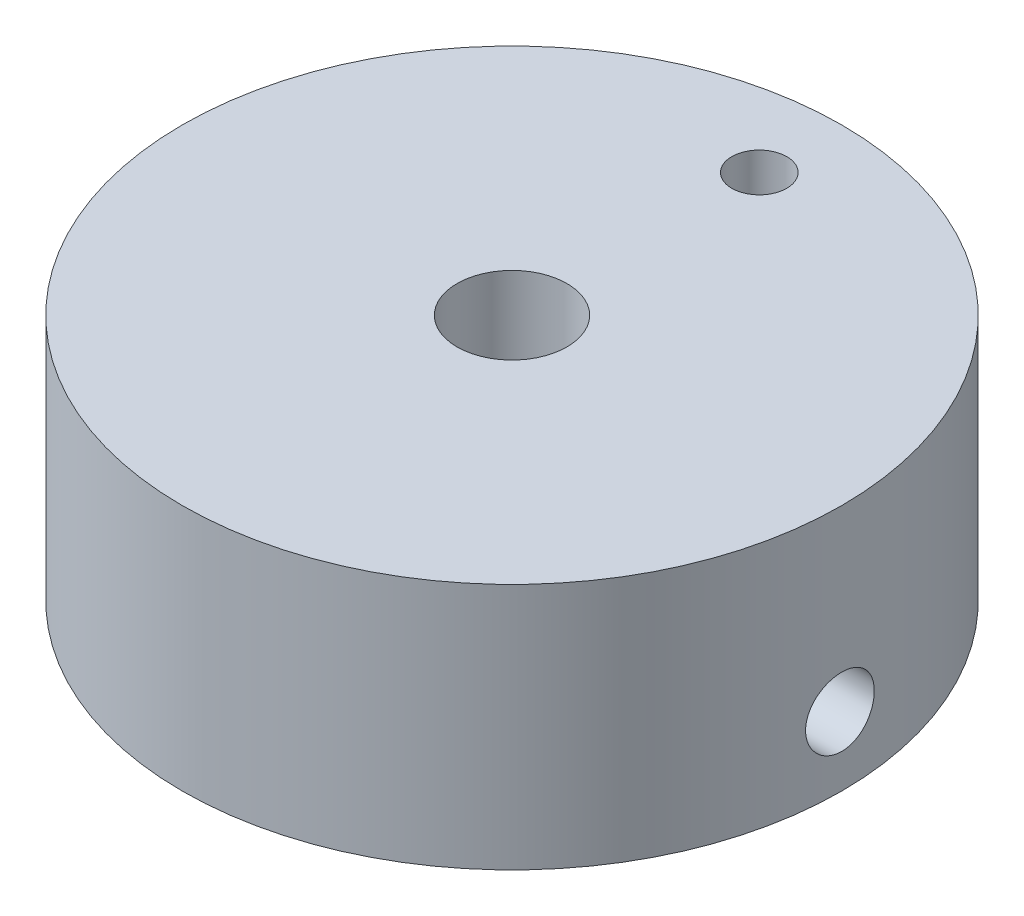
ISO-10303-21;
HEADER;
FILE_DESCRIPTION(('STEP AP214'),'2;1');
FILE_NAME('part.step','',(''),(''),'','','');
FILE_SCHEMA(('AUTOMOTIVE_DESIGN { 1 0 10303 214 1 1 1 1 }'));
ENDSEC;
DATA;
#1=APPLICATION_CONTEXT('core data for automotive mechanical design processes');
#2=APPLICATION_PROTOCOL_DEFINITION('international standard','automotive_design',2000,#1);
#3=PRODUCT_CONTEXT('',#1,'mechanical');
#4=PRODUCT('Part','Part','',(#3));
#5=PRODUCT_RELATED_PRODUCT_CATEGORY('part','',(#4));
#6=PRODUCT_DEFINITION_FORMATION('','',#4);
#7=PRODUCT_DEFINITION_CONTEXT('part definition',#1,'design');
#8=PRODUCT_DEFINITION('design','',#6,#7);
#9=PRODUCT_DEFINITION_SHAPE('','',#8);
#10=(LENGTH_UNIT() NAMED_UNIT(*) SI_UNIT(.MILLI.,.METRE.));
#11=(NAMED_UNIT(*) PLANE_ANGLE_UNIT() SI_UNIT($,.RADIAN.));
#12=(NAMED_UNIT(*) SI_UNIT($,.STERADIAN.) SOLID_ANGLE_UNIT());
#13=UNCERTAINTY_MEASURE_WITH_UNIT(LENGTH_MEASURE(1.E-05),#10,'distance_accuracy_value','');
#14=(GEOMETRIC_REPRESENTATION_CONTEXT(3) GLOBAL_UNCERTAINTY_ASSIGNED_CONTEXT((#13)) GLOBAL_UNIT_ASSIGNED_CONTEXT((#10,
#11,#12)) REPRESENTATION_CONTEXT('',''));
#15=CARTESIAN_POINT('',(0.,0.,0.));
#16=DIRECTION('',(0.,0.,1.));
#17=DIRECTION('',(1.,0.,0.));
#18=AXIS2_PLACEMENT_3D('',#15,#16,#17);
#19=CARTESIAN_POINT('',(0.,0.,0.));
#20=DIRECTION('',(0.,1.,0.));
#21=DIRECTION('',(0.,0.,1.));
#22=AXIS2_PLACEMENT_3D('',#19,#20,#21);
#23=PLANE('',#22);
#24=CARTESIAN_POINT('',(0.,0.,0.));
#25=DIRECTION('',(0.,1.,0.));
#26=DIRECTION('',(0.,0.,1.));
#27=AXIS2_PLACEMENT_3D('',#24,#25,#26);
#28=CIRCLE('',#27,2.);
#29=CARTESIAN_POINT('',(0.,0.,2.));
#30=VERTEX_POINT('',#29);
#31=EDGE_CURVE('E58',#30,#30,#28,.T.);
#32=ORIENTED_EDGE('',*,*,#31,.T.);
#33=EDGE_LOOP('',(#32));
#34=FACE_BOUND('',#33,.T.);
#35=CARTESIAN_POINT('',(0.,0.,0.));
#36=DIRECTION('',(0.,-1.,0.));
#37=DIRECTION('',(0.,0.,-1.));
#38=AXIS2_PLACEMENT_3D('',#35,#36,#37);
#39=CIRCLE('',#38,3.5);
#40=CARTESIAN_POINT('',(0.,0.,-3.5));
#41=VERTEX_POINT('',#40);
#42=EDGE_CURVE('E120',#41,#41,#39,.T.);
#43=ORIENTED_EDGE('',*,*,#42,.T.);
#44=EDGE_LOOP('',(#43));
#45=FACE_BOUND('',#44,.T.);
#46=ADVANCED_FACE('F39',(#34,#45),#23,.F.);
#47=CARTESIAN_POINT('',(0.,9.,0.));
#48=DIRECTION('',(0.,-1.,0.));
#49=DIRECTION('',(0.,0.,-1.));
#50=AXIS2_PLACEMENT_3D('',#47,#48,#49);
#51=CYLINDRICAL_SURFACE('',#50,12.);
#52=CARTESIAN_POINT('',(0.,9.,0.));
#53=DIRECTION('',(0.,1.,0.));
#54=DIRECTION('',(0.,0.,1.));
#55=AXIS2_PLACEMENT_3D('',#52,#53,#54);
#56=CIRCLE('',#55,12.);
#57=CARTESIAN_POINT('',(0.,9.,12.));
#58=VERTEX_POINT('',#57);
#59=EDGE_CURVE('E10',#58,#58,#56,.T.);
#60=ORIENTED_EDGE('',*,*,#59,.F.);
#61=EDGE_LOOP('',(#60));
#62=FACE_BOUND('',#61,.T.);
#63=CARTESIAN_POINT('',(0.,0.,0.));
#64=DIRECTION('',(0.,1.,0.));
#65=DIRECTION('',(0.,0.,1.));
#66=AXIS2_PLACEMENT_3D('',#63,#64,#65);
#67=CIRCLE('',#66,12.);
#68=CARTESIAN_POINT('',(0.,0.,12.));
#69=VERTEX_POINT('',#68);
#70=EDGE_CURVE('E53',#69,#69,#67,.T.);
#71=ORIENTED_EDGE('',*,*,#70,.T.);
#72=EDGE_LOOP('',(#71));
#73=FACE_BOUND('',#72,.T.);
#74=CARTESIAN_POINT('',(11.93471826228,2.5,1.25));
#75=CARTESIAN_POINT('',(11.9347191150424,2.42999161232566,1.24999697518322));
#76=CARTESIAN_POINT('',(11.9353409008733,2.35993731760407,1.24409877692397));
#77=CARTESIAN_POINT('',(11.9377604270999,2.22177211791096,1.22065943041038));
#78=CARTESIAN_POINT('',(11.9395594532585,2.15366342287391,1.20310555170272));
#79=CARTESIAN_POINT('',(11.9441275217712,2.02141020375438,1.15687251656011));
#80=CARTESIAN_POINT('',(11.9468959653314,1.95726326126662,1.1282002266226));
#81=CARTESIAN_POINT('',(11.9530902004971,1.83470581039826,1.06055770334252));
#82=CARTESIAN_POINT('',(11.9565158642756,1.7762941898514,1.02158947197067));
#83=CARTESIAN_POINT('',(11.9636536449667,1.6666221821392,0.934296678407943));
#84=CARTESIAN_POINT('',(11.967366722546,1.61538754113538,0.885939844855282));
#85=CARTESIAN_POINT('',(11.9746522541305,1.52174566920759,0.781311583098957));
#86=CARTESIAN_POINT('',(11.9782247016127,1.47933884736844,0.725039788315086));
#87=CARTESIAN_POINT('',(11.9848360068635,1.4044667974439,0.606020494104223));
#88=CARTESIAN_POINT('',(11.987873629993,1.37202444712256,0.543258528434127));
#89=CARTESIAN_POINT('',(11.99306255589,1.31814864374241,0.413140786628793));
#90=CARTESIAN_POINT('',(11.9952138819629,1.29671490120643,0.345785131339821));
#91=CARTESIAN_POINT('',(11.9983810704125,1.26554050090853,0.208652729588977));
#92=CARTESIAN_POINT('',(11.999401047473,1.25575746024736,0.138885714600318));
#93=CARTESIAN_POINT('',(12.0002046174434,1.24803099594927,-0.00130690592329531));
#94=CARTESIAN_POINT('',(11.9999882449266,1.25008724123906,-0.0717324929869851));
#95=CARTESIAN_POINT('',(11.9983468568877,1.2659466414109,-0.210955320524874));
#96=CARTESIAN_POINT('',(11.9969265307067,1.27970422086826,-0.279757815683589));
#97=CARTESIAN_POINT('',(11.9930422118587,1.31850472481392,-0.414071941104615));
#98=CARTESIAN_POINT('',(11.990578204652,1.34354780652158,-0.479583525506811));
#99=CARTESIAN_POINT('',(11.9848754491254,1.40425817632148,-0.605599466983969));
#100=CARTESIAN_POINT('',(11.981635237351,1.43994556469558,-0.666094071486266));
#101=CARTESIAN_POINT('',(11.974743492089,1.52091691518019,-0.780252420210233));
#102=CARTESIAN_POINT('',(11.9710919455069,1.56620118283928,-0.833915946854722));
#103=CARTESIAN_POINT('',(11.963766675583,1.66533699661674,-0.933155896006396));
#104=CARTESIAN_POINT('',(11.9600929292666,1.71922820058642,-0.978692709827727));
#105=CARTESIAN_POINT('',(11.9531545861231,1.83391080822329,-1.06007978169065));
#106=CARTESIAN_POINT('',(11.9498899899754,1.89470222334929,-1.09593002364596));
#107=CARTESIAN_POINT('',(11.944139339682,2.02149078075045,-1.15692647329621));
#108=CARTESIAN_POINT('',(11.9416534715147,2.08748916186732,-1.18207012452017));
#109=CARTESIAN_POINT('',(11.9377455447301,2.22280266139245,-1.22090774282747));
#110=CARTESIAN_POINT('',(11.9363234508818,2.29211766987692,-1.2346020891004));
#111=CARTESIAN_POINT('',(11.9347102430423,2.43174878649403,-1.25010118777219));
#112=CARTESIAN_POINT('',(11.9345133869079,2.50205867463572,-1.25196140238156));
#113=CARTESIAN_POINT('',(11.9353577854573,2.641989150664,-1.24388519226921));
#114=CARTESIAN_POINT('',(11.9363990219608,2.71160974865697,-1.23394894076646));
#115=CARTESIAN_POINT('',(11.9395970583523,2.84802302111028,-1.20260829999998));
#116=CARTESIAN_POINT('',(11.9417512975577,2.91482180772134,-1.18123023085877));
#117=CARTESIAN_POINT('',(11.9469305336369,3.04388546043428,-1.12763970354659));
#118=CARTESIAN_POINT('',(11.9499555520955,3.10615021409802,-1.09542697680141));
#119=CARTESIAN_POINT('',(11.9565493817568,3.22463084933737,-1.02094298796706));
#120=CARTESIAN_POINT('',(11.9601201592886,3.28082355125212,-0.978635031111928));
#121=CARTESIAN_POINT('',(11.967396775493,3.38532970135615,-0.88521403435345));
#122=CARTESIAN_POINT('',(11.9711026177939,3.43364293768763,-0.834100757774513));
#123=CARTESIAN_POINT('',(11.9782491893122,3.52121052312097,-0.72427917668722));
#124=CARTESIAN_POINT('',(11.9816888233373,3.56042865095765,-0.665541909470564));
#125=CARTESIAN_POINT('',(11.9878994174722,3.62844330330774,-0.542282402189452));
#126=CARTESIAN_POINT('',(11.9906703874177,3.65723998111873,-0.477760247237037));
#127=CARTESIAN_POINT('',(11.9952265074374,3.70353316317402,-0.34488802523341));
#128=CARTESIAN_POINT('',(11.9970135525649,3.72105140095761,-0.276545597858168));
#129=CARTESIAN_POINT('',(11.9994082618957,3.74436132253283,-0.137869776943723));
#130=CARTESIAN_POINT('',(12.0000159622655,3.75015336592635,-0.0675364445257738));
#131=CARTESIAN_POINT('',(11.9999834694783,3.7498411794133,0.0727692297748155));
#132=CARTESIAN_POINT('',(11.9993491685798,3.74379312092574,0.142741704768554));
#133=CARTESIAN_POINT('',(11.996915580434,3.72009037967924,0.280670736530767));
#134=CARTESIAN_POINT('',(11.9951162924927,3.70243569000579,0.348627292098257));
#135=CARTESIAN_POINT('',(11.990554266156,3.65603672857729,0.480593939441468));
#136=CARTESIAN_POINT('',(11.9877916847795,3.62729426407236,0.544604672394931));
#137=CARTESIAN_POINT('',(11.9816107070057,3.55954158187077,0.666902233444958));
#138=CARTESIAN_POINT('',(11.9781923126532,3.52053139618754,0.725189079387079));
#139=CARTESIAN_POINT('',(11.9710630656975,3.43314031847674,0.834672111183025));
#140=CARTESIAN_POINT('',(11.9673509527786,3.38471758354817,0.885834816188336));
#141=CARTESIAN_POINT('',(11.960063235384,3.27995948076493,0.979332809391577));
#142=CARTESIAN_POINT('',(11.9564876638058,3.22362222113315,1.02166598107297));
#143=CARTESIAN_POINT('',(11.9498674099473,3.10446396710885,1.09639613404272));
#144=CARTESIAN_POINT('',(11.94682420674,3.04162565724996,1.12876561682157));
#145=CARTESIAN_POINT('',(11.9416308093055,2.91141319106628,1.18244985814836));
#146=CARTESIAN_POINT('',(11.9394796137875,2.84404421977557,1.203777018579));
#147=CARTESIAN_POINT('',(11.9368532731593,2.73024876142971,1.22948475987797));
#148=CARTESIAN_POINT('',(11.9360564602914,2.68454844517094,1.23716737923509));
#149=CARTESIAN_POINT('',(11.9349886741132,2.59257210934299,1.24742598754874));
#150=CARTESIAN_POINT('',(11.9347176983538,2.54629609245642,1.2500020002917));
#151=CARTESIAN_POINT('',(11.93471826228,2.5,1.25));
#152=B_SPLINE_CURVE_WITH_KNOTS('',3,(#74,#75,#76,#77,#78,#79,#80,#81,#82,#83,#84,#85,#86,#87,
#88,#89,#90,#91,#92,#93,#94,#95,#96,#97,#98,#99,#100,#101,#102,#103,#104,#105,#106,#107,#108,
#109,#110,#111,#112,#113,#114,#115,#116,#117,#118,#119,#120,#121,#122,#123,#124,#125,#126,#127,
#128,#129,#130,#131,#132,#133,#134,#135,#136,#137,#138,#139,#140,#141,#142,#143,#144,#145,#146,
#147,#148,#149,#150,#151),.UNSPECIFIED.,.T.,.F.,(4,2,2,2,2,2,2,2,2,2,2,2,2,2,2,2,2,2,2,2,2,2,2,
2,2,2,2,2,2,2,2,2,2,2,2,2,2,2,4),(0.,0.209856088918114,0.419941762656934,0.629897897997549,
0.839813238904374,1.05046331966474,1.26112315986553,1.47226310667903,1.68339750117152,
1.89376146209515,2.1041195404386,2.31366202924334,2.52320743729405,2.73315107506366,
2.94310139809176,3.15404859825978,3.36499614874125,3.57599404011223,3.78698494316603,
3.99698627668495,4.20698452658867,4.41650177142426,4.62602421024736,4.83632015771437,
5.04662175854641,5.25774702917369,5.46886919406139,5.67958329938647,5.89029094273986,
6.10000137609484,6.30971193438228,6.51938832536296,6.72906406260766,6.93969414529675,
7.15037465998275,7.36163151780615,7.57265059074992,7.71142770693246,7.85020417669335),.UNSPECIFIED.);
#153=CARTESIAN_POINT('',(11.93471826228,2.5,1.25));
#154=VERTEX_POINT('',#153);
#155=EDGE_CURVE('E69',#154,#154,#152,.T.);
#156=ORIENTED_EDGE('',*,*,#155,.F.);
#157=EDGE_LOOP('',(#156));
#158=FACE_BOUND('',#157,.T.);
#159=ADVANCED_FACE('F41',(#62,#73,#158),#51,.T.);
#160=CARTESIAN_POINT('',(0.,0.,0.));
#161=DIRECTION('',(0.,1.,0.));
#162=DIRECTION('',(0.,0.,1.));
#163=AXIS2_PLACEMENT_3D('',#160,#161,#162);
#164=CYLINDRICAL_SURFACE('',#163,2.);
#165=ORIENTED_EDGE('',*,*,#31,.F.);
#166=EDGE_LOOP('',(#165));
#167=FACE_BOUND('',#166,.T.);
#168=CARTESIAN_POINT('',(0.,9.,0.));
#169=DIRECTION('',(0.,1.,0.));
#170=DIRECTION('',(0.,0.,1.));
#171=AXIS2_PLACEMENT_3D('',#168,#169,#170);
#172=CIRCLE('',#171,2.);
#173=CARTESIAN_POINT('',(0.,9.,2.));
#174=VERTEX_POINT('',#173);
#175=EDGE_CURVE('E60',#174,#174,#172,.T.);
#176=ORIENTED_EDGE('',*,*,#175,.T.);
#177=EDGE_LOOP('',(#176));
#178=FACE_BOUND('',#177,.T.);
#179=CARTESIAN_POINT('',(1.5612494995996,2.5,1.25));
#180=CARTESIAN_POINT('',(1.56125800072558,2.56212028180293,1.24999462210485));
#181=CARTESIAN_POINT('',(1.56502642708837,2.62433783537026,1.24532693849666));
#182=CARTESIAN_POINT('',(1.57943717205478,2.74667632007938,1.22698950832934));
#183=CARTESIAN_POINT('',(1.59009816464115,2.80679108636524,1.21329530430551));
#184=CARTESIAN_POINT('',(1.61650085329041,2.92278232269884,1.17788073911871));
#185=CARTESIAN_POINT('',(1.63219837418033,2.97869060868181,1.15622993332784));
#186=CARTESIAN_POINT('',(1.66682950714432,3.08600886163816,1.10571945561924));
#187=CARTESIAN_POINT('',(1.68576320748676,3.13741870585651,1.07685958706091));
#188=CARTESIAN_POINT('',(1.72779611374711,3.24186515447698,1.00823937928364));
#189=CARTESIAN_POINT('',(1.75111338227346,3.29419474083259,0.967536093692502));
#190=CARTESIAN_POINT('',(1.79752820854877,3.39188269914497,0.878308664496878));
#191=CARTESIAN_POINT('',(1.82062555863329,3.43723499728392,0.829777781297412));
#192=CARTESIAN_POINT('',(1.86729453891009,3.52510358514812,0.71918666525849));
#193=CARTESIAN_POINT('',(1.8905872224145,3.56661766810431,0.656200568910555));
#194=CARTESIAN_POINT('',(1.9318323169914,3.63812520476316,0.522404070837314));
#195=CARTESIAN_POINT('',(1.94979001179838,3.66813006575126,0.45160150647824));
#196=CARTESIAN_POINT('',(1.97669841318201,3.71248231060706,0.311776878362017));
#197=CARTESIAN_POINT('',(1.98637922422038,3.72811141639694,0.24330563604724));
#198=CARTESIAN_POINT('',(1.99850544379202,3.7476320696434,0.104105100662262));
#199=CARTESIAN_POINT('',(2.00095845843657,3.75153595612055,0.0333782605640262));
#200=CARTESIAN_POINT('',(1.99852909107528,3.74764431072239,-0.0980658284213407));
#201=CARTESIAN_POINT('',(1.99458699811902,3.7413486236991,-0.158852523273786));
#202=CARTESIAN_POINT('',(1.98145272261225,3.72013301563668,-0.27830664590367));
#203=CARTESIAN_POINT('',(1.97226014325117,3.70521244276248,-0.336973913146974));
#204=CARTESIAN_POINT('',(1.94938133614675,3.66739622490288,-0.450889117077073));
#205=CARTESIAN_POINT('',(1.93568361673912,3.64448017595141,-0.506127875493233));
#206=CARTESIAN_POINT('',(1.90485632889331,3.59153124474001,-0.612019220469382));
#207=CARTESIAN_POINT('',(1.88772597874226,3.5614967411094,-0.662670758560001));
#208=CARTESIAN_POINT('',(1.84893224750793,3.49097183467063,-0.764713515567041));
#209=CARTESIAN_POINT('',(1.82697004307144,3.44964537325767,-0.815412344918949));
#210=CARTESIAN_POINT('',(1.78195462752237,3.35986761977663,-0.909598595905498));
#211=CARTESIAN_POINT('',(1.75889986449171,3.31140597355345,-0.953075338789632));
#212=CARTESIAN_POINT('',(1.71071442112196,3.2012943770939,-1.03735445892932));
#213=CARTESIAN_POINT('',(1.68570581533195,3.1387486191497,-1.07706615479946));
#214=CARTESIAN_POINT('',(1.640141390954,3.00635388022658,-1.14526153203309));
#215=CARTESIAN_POINT('',(1.6195774019168,2.93651865604459,-1.17376589603358));
#216=CARTESIAN_POINT('',(1.5909187656712,2.81023059711213,-1.21218566853166));
#217=CARTESIAN_POINT('',(1.58096704305272,2.75508903736233,-1.22501841721721));
#218=CARTESIAN_POINT('',(1.56679138875765,2.64288481125107,-1.24310168537523));
#219=CARTESIAN_POINT('',(1.56255963237428,2.5858248789601,-1.24836256353275));
#220=CARTESIAN_POINT('',(1.56046133530164,2.47127131945973,-1.25098535954508));
#221=CARTESIAN_POINT('',(1.56260938140435,2.41377699863418,-1.24832917576576));
#222=CARTESIAN_POINT('',(1.57296042862705,2.3002194189684,-1.23525733555987));
#223=CARTESIAN_POINT('',(1.58116844404657,2.24415738503708,-1.22483525320262));
#224=CARTESIAN_POINT('',(1.60230060601957,2.13578161613419,-1.1970493572483));
#225=CARTESIAN_POINT('',(1.61514477937171,2.08342132666849,-1.17980280626788));
#226=CARTESIAN_POINT('',(1.64415573440842,1.98221266544302,-1.13902451938523));
#227=CARTESIAN_POINT('',(1.66032369489908,1.9333655479755,-1.11549055271421));
#228=CARTESIAN_POINT('',(1.69787203988937,1.83069396082297,-1.05765376772319));
#229=CARTESIAN_POINT('',(1.7196587573829,1.77769245875067,-1.02215373814221));
#230=CARTESIAN_POINT('',(1.76393958000711,1.67781494756085,-0.943690263224862));
#231=CARTESIAN_POINT('',(1.78643439903354,1.63094538302204,-0.900719074496599));
#232=CARTESIAN_POINT('',(1.83383164018972,1.53701675375684,-0.800380659499192));
#233=CARTESIAN_POINT('',(1.85854204787597,1.49113144299232,-0.741809949714162));
#234=CARTESIAN_POINT('',(1.90384248964999,1.40993134812414,-0.616299987869576));
#235=CARTESIAN_POINT('',(1.92443445329133,1.37461161002636,-0.54936467874866));
#236=CARTESIAN_POINT('',(1.95809255957561,1.31800500879736,-0.412925900636597));
#237=CARTESIAN_POINT('',(1.9715348458918,1.29600579352924,-0.343814822544517));
#238=CARTESIAN_POINT('',(1.9910701008804,1.26427333131891,-0.201860998884744));
#239=CARTESIAN_POINT('',(1.99717323933003,1.25452311023889,-0.129023563238365));
#240=CARTESIAN_POINT('',(2.00096685748559,1.24845347996122,0.00659907199681402));
#241=CARTESIAN_POINT('',(1.99976600623617,1.25036422321302,0.0692812975954758));
#242=CARTESIAN_POINT('',(1.99160739958772,1.26346167497434,0.193279811091727));
#243=CARTESIAN_POINT('',(1.98464990541518,1.27464796257577,0.254596160840744));
#244=CARTESIAN_POINT('',(1.9659610468898,1.30516047487659,0.372043294685527));
#245=CARTESIAN_POINT('',(1.95440367471701,1.3241908398732,0.42828018067831));
#246=CARTESIAN_POINT('',(1.92744968677265,1.36955992816407,0.536714369111315));
#247=CARTESIAN_POINT('',(1.91205242331406,1.39589988447559,0.58891098811824));
#248=CARTESIAN_POINT('',(1.87675342239825,1.4581605789912,0.693656737470667));
#249=CARTESIAN_POINT('',(1.85655002466956,1.49479198131898,0.745680127162212));
#250=CARTESIAN_POINT('',(1.81433640456238,1.5750766303327,0.843216608355415));
#251=CARTESIAN_POINT('',(1.7923241573062,1.61873780024594,0.888722243055231));
#252=CARTESIAN_POINT('',(1.74500415099525,1.71911626230327,0.978723601300806));
#253=CARTESIAN_POINT('',(1.71967871446314,1.77680834517692,1.02212829873816));
#254=CARTESIAN_POINT('',(1.67174821497037,1.89964466601012,1.09877325005744));
#255=CARTESIAN_POINT('',(1.64914165167051,1.9647847549076,1.132019125571));
#256=CARTESIAN_POINT('',(1.61429776080214,2.08640276792967,1.18099110923231));
#257=CARTESIAN_POINT('',(1.60087340349652,2.14163568087936,1.19896216276381));
#258=CARTESIAN_POINT('',(1.57939158437939,2.25496927795719,1.22712822180408));
#259=CARTESIAN_POINT('',(1.57131714400176,2.31306025502414,1.23734784245405));
#260=CARTESIAN_POINT('',(1.56476456389394,2.39303052386285,1.24559906183097));
#261=CARTESIAN_POINT('',(1.56345069546827,2.41436414551699,1.24724671259581));
#262=CARTESIAN_POINT('',(1.56169158695047,2.45712796652149,1.24944824734288));
#263=CARTESIAN_POINT('',(1.56124656529967,2.47855818880168,1.25000185626673));
#264=CARTESIAN_POINT('',(1.5612494995996,2.5,1.25));
#265=B_SPLINE_CURVE_WITH_KNOTS('',3,(#179,#180,#181,#182,#183,#184,#185,#186,#187,#188,#189,
#190,#191,#192,#193,#194,#195,#196,#197,#198,#199,#200,#201,#202,#203,#204,#205,#206,#207,#208,
#209,#210,#211,#212,#213,#214,#215,#216,#217,#218,#219,#220,#221,#222,#223,#224,#225,#226,#227,
#228,#229,#230,#231,#232,#233,#234,#235,#236,#237,#238,#239,#240,#241,#242,#243,#244,#245,#246,
#247,#248,#249,#250,#251,#252,#253,#254,#255,#256,#257,#258,#259,#260,#261,#262,#263,#264),
.UNSPECIFIED.,.T.,.F.,(4,2,2,2,2,2,2,2,2,2,2,2,2,2,2,2,2,2,2,2,2,2,2,2,2,2,2,2,2,2,2,2,2,2,2,2,
2,2,2,2,2,2,4),(0.,0.186262444012015,0.373031654397096,0.558205556130402,0.743384509377751,
0.953406207440075,1.16360970997911,1.39917236034457,1.6345009273926,1.84590412815398,
2.05708478092387,2.23992319583511,2.42277543076414,2.60609774825956,2.78946186128171,
2.99564504832107,3.20213044016186,3.43558067920821,3.66859805095277,3.84032775480268,
4.01182230007289,4.18370925240739,4.35573859160081,4.52493212343598,4.69418576487135,
4.89566333610129,5.09735098485254,5.33136598660889,5.56527109061626,5.78520080494549,
6.00482541258961,6.19203601525124,6.37923812308583,6.55994569114424,6.74068376037881,
6.94018144108745,7.13990556958868,7.36841817421249,7.59680409585386,7.77496902270413,
7.95256577963385,8.01684109069498,8.08113255947022),.UNSPECIFIED.);
#266=CARTESIAN_POINT('',(1.5612494995996,2.5,1.25));
#267=VERTEX_POINT('',#266);
#268=EDGE_CURVE('E44',#267,#267,#265,.T.);
#269=ORIENTED_EDGE('',*,*,#268,.F.);
#270=EDGE_LOOP('',(#269));
#271=FACE_BOUND('',#270,.T.);
#272=ADVANCED_FACE('F96',(#167,#178,#271),#164,.F.);
#273=CARTESIAN_POINT('',(0.,9.,0.));
#274=DIRECTION('',(0.,1.,0.));
#275=DIRECTION('',(0.,0.,1.));
#276=AXIS2_PLACEMENT_3D('',#273,#274,#275);
#277=PLANE('',#276);
#278=CARTESIAN_POINT('',(0.,9.,-9.));
#279=DIRECTION('',(0.,1.,0.));
#280=DIRECTION('',(0.,0.,1.));
#281=AXIS2_PLACEMENT_3D('',#278,#279,#280);
#282=CIRCLE('',#281,1.);
#283=CARTESIAN_POINT('',(0.,9.,-8.));
#284=VERTEX_POINT('',#283);
#285=EDGE_CURVE('E66',#284,#284,#282,.T.);
#286=ORIENTED_EDGE('',*,*,#285,.F.);
#287=EDGE_LOOP('',(#286));
#288=FACE_BOUND('',#287,.T.);
#289=ORIENTED_EDGE('',*,*,#175,.F.);
#290=EDGE_LOOP('',(#289));
#291=FACE_BOUND('',#290,.T.);
#292=ORIENTED_EDGE('',*,*,#59,.T.);
#293=EDGE_LOOP('',(#292));
#294=FACE_BOUND('',#293,.T.);
#295=ADVANCED_FACE('F100',(#288,#291,#294),#277,.T.);
#296=CARTESIAN_POINT('',(0.,0.,0.));
#297=DIRECTION('',(0.,-1.,0.));
#298=DIRECTION('',(0.,0.,-1.));
#299=AXIS2_PLACEMENT_3D('',#296,#297,#298);
#300=CIRCLE('',#299,7.5);
#301=CARTESIAN_POINT('',(0.,0.,-7.5));
#302=VERTEX_POINT('',#301);
#303=EDGE_CURVE('E77',#302,#302,#300,.T.);
#304=ORIENTED_EDGE('',*,*,#303,.F.);
#305=EDGE_LOOP('',(#304));
#306=FACE_BOUND('',#305,.T.);
#307=ORIENTED_EDGE('',*,*,#70,.F.);
#308=EDGE_LOOP('',(#307));
#309=FACE_BOUND('',#308,.T.);
#310=ADVANCED_FACE('F94',(#306,#309),#23,.F.);
#311=CARTESIAN_POINT('',(0.,6.,-9.));
#312=DIRECTION('',(0.,1.,0.));
#313=DIRECTION('',(0.,0.,1.));
#314=AXIS2_PLACEMENT_3D('',#311,#312,#313);
#315=CYLINDRICAL_SURFACE('',#314,1.);
#316=CARTESIAN_POINT('',(0.,6.,-9.));
#317=DIRECTION('',(0.,1.,0.));
#318=DIRECTION('',(0.,0.,1.));
#319=AXIS2_PLACEMENT_3D('',#316,#317,#318);
#320=CIRCLE('',#319,1.);
#321=CARTESIAN_POINT('',(0.,6.,-8.));
#322=VERTEX_POINT('',#321);
#323=EDGE_CURVE('E63',#322,#322,#320,.T.);
#324=ORIENTED_EDGE('',*,*,#323,.F.);
#325=EDGE_LOOP('',(#324));
#326=FACE_BOUND('',#325,.T.);
#327=ORIENTED_EDGE('',*,*,#285,.T.);
#328=EDGE_LOOP('',(#327));
#329=FACE_BOUND('',#328,.T.);
#330=ADVANCED_FACE('F91',(#326,#329),#315,.F.);
#331=CARTESIAN_POINT('',(0.,6.,-9.));
#332=DIRECTION('',(0.,1.,0.));
#333=DIRECTION('',(0.,0.,1.));
#334=AXIS2_PLACEMENT_3D('',#331,#332,#333);
#335=PLANE('',#334);
#336=ORIENTED_EDGE('',*,*,#323,.T.);
#337=EDGE_LOOP('',(#336));
#338=FACE_BOUND('',#337,.T.);
#339=ADVANCED_FACE('F85',(#338),#335,.T.);
#340=CARTESIAN_POINT('',(13.,2.5,0.));
#341=DIRECTION('',(-1.,0.,0.));
#342=DIRECTION('',(0.,0.,1.));
#343=AXIS2_PLACEMENT_3D('',#340,#341,#342);
#344=CYLINDRICAL_SURFACE('',#343,1.25);
#345=ORIENTED_EDGE('',*,*,#268,.T.);
#346=EDGE_LOOP('',(#345));
#347=FACE_BOUND('',#346,.T.);
#348=ORIENTED_EDGE('',*,*,#155,.T.);
#349=EDGE_LOOP('',(#348));
#350=FACE_BOUND('',#349,.T.);
#351=ADVANCED_FACE('F79',(#347,#350),#344,.F.);
#352=CARTESIAN_POINT('',(0.,0.3,0.));
#353=DIRECTION('',(0.,-1.,0.));
#354=DIRECTION('',(0.,0.,-1.));
#355=AXIS2_PLACEMENT_3D('',#352,#353,#354);
#356=CYLINDRICAL_SURFACE('',#355,7.5);
#357=CARTESIAN_POINT('',(0.,0.3,0.));
#358=DIRECTION('',(0.,-1.,0.));
#359=DIRECTION('',(0.,0.,-1.));
#360=AXIS2_PLACEMENT_3D('',#357,#358,#359);
#361=CIRCLE('',#360,7.5);
#362=CARTESIAN_POINT('',(0.,0.3,-7.5));
#363=VERTEX_POINT('',#362);
#364=EDGE_CURVE('E126',#363,#363,#361,.T.);
#365=ORIENTED_EDGE('',*,*,#364,.F.);
#366=EDGE_LOOP('',(#365));
#367=FACE_BOUND('',#366,.T.);
#368=ORIENTED_EDGE('',*,*,#303,.T.);
#369=EDGE_LOOP('',(#368));
#370=FACE_BOUND('',#369,.T.);
#371=ADVANCED_FACE('F84',(#367,#370),#356,.F.);
#372=CARTESIAN_POINT('',(0.,0.3,0.));
#373=DIRECTION('',(0.,-1.,0.));
#374=DIRECTION('',(0.,0.,-1.));
#375=AXIS2_PLACEMENT_3D('',#372,#373,#374);
#376=PLANE('',#375);
#377=CARTESIAN_POINT('',(0.,0.3,0.));
#378=DIRECTION('',(0.,-1.,0.));
#379=DIRECTION('',(0.,0.,-1.));
#380=AXIS2_PLACEMENT_3D('',#377,#378,#379);
#381=CIRCLE('',#380,3.5);
#382=CARTESIAN_POINT('',(0.,0.3,-3.5));
#383=VERTEX_POINT('',#382);
#384=EDGE_CURVE('E122',#383,#383,#381,.T.);
#385=ORIENTED_EDGE('',*,*,#384,.F.);
#386=EDGE_LOOP('',(#385));
#387=FACE_BOUND('',#386,.T.);
#388=ORIENTED_EDGE('',*,*,#364,.T.);
#389=EDGE_LOOP('',(#388));
#390=FACE_BOUND('',#389,.T.);
#391=ADVANCED_FACE('F134',(#387,#390),#376,.T.);
#392=CARTESIAN_POINT('',(0.,0.3,0.));
#393=DIRECTION('',(0.,-1.,0.));
#394=DIRECTION('',(0.,0.,-1.));
#395=AXIS2_PLACEMENT_3D('',#392,#393,#394);
#396=CYLINDRICAL_SURFACE('',#395,3.5);
#397=ORIENTED_EDGE('',*,*,#384,.T.);
#398=EDGE_LOOP('',(#397));
#399=FACE_BOUND('',#398,.T.);
#400=ORIENTED_EDGE('',*,*,#42,.F.);
#401=EDGE_LOOP('',(#400));
#402=FACE_BOUND('',#401,.T.);
#403=ADVANCED_FACE('F139',(#399,#402),#396,.T.);
#404=CLOSED_SHELL('',(#46,#159,#272,#295,#310,#330,#339,#351,#371,#391,#403));
#405=MANIFOLD_SOLID_BREP('B2',#404);
#406=ADVANCED_BREP_SHAPE_REPRESENTATION('',(#18,#405),#14);
#407=SHAPE_DEFINITION_REPRESENTATION(#9,#406);
ENDSEC;
END-ISO-10303-21;
